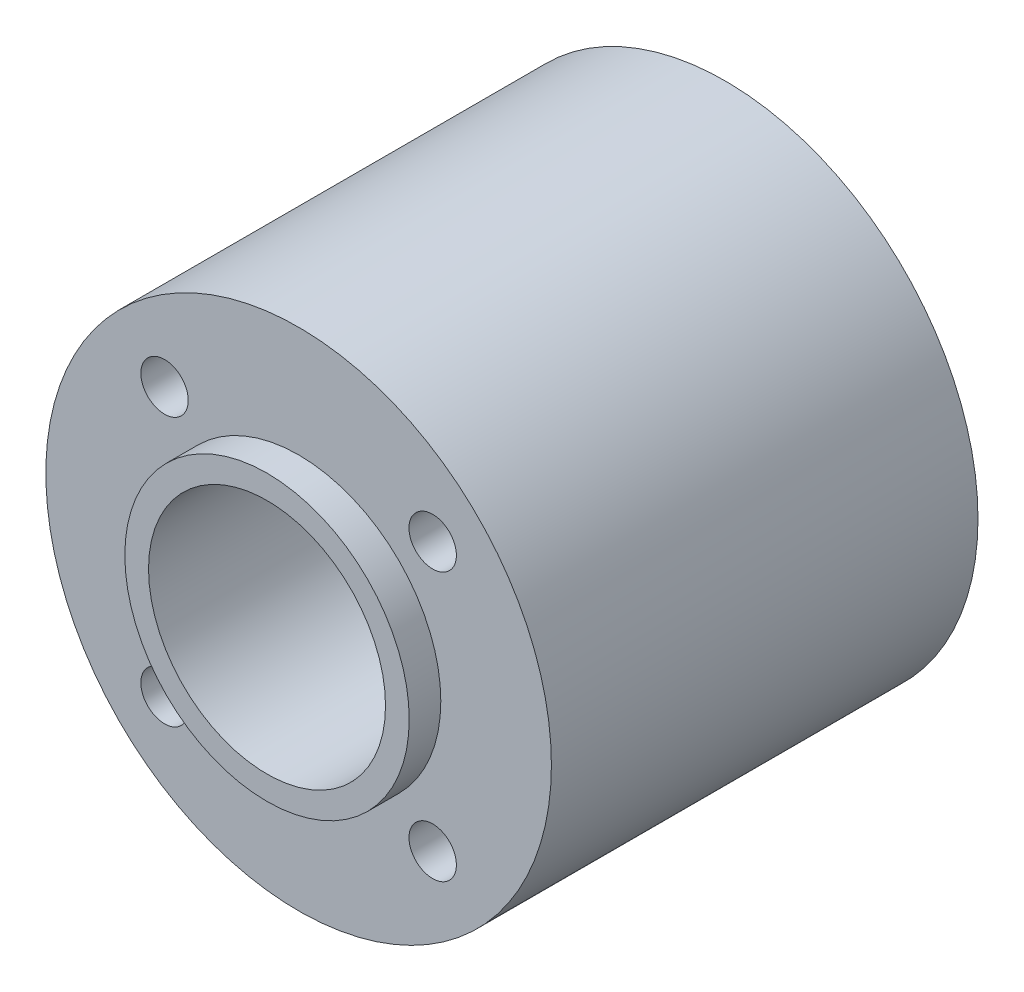
ISO-10303-21;
HEADER;
FILE_DESCRIPTION(('STEP AP214'),'2;1');
FILE_NAME('part.step','',(''),(''),'','','');
FILE_SCHEMA(('AUTOMOTIVE_DESIGN { 1 0 10303 214 1 1 1 1 }'));
ENDSEC;
DATA;
#1=APPLICATION_CONTEXT('core data for automotive mechanical design processes');
#2=APPLICATION_PROTOCOL_DEFINITION('international standard','automotive_design',2000,#1);
#3=PRODUCT_CONTEXT('',#1,'mechanical');
#4=PRODUCT('Part','Part','',(#3));
#5=PRODUCT_RELATED_PRODUCT_CATEGORY('part','',(#4));
#6=PRODUCT_DEFINITION_FORMATION('','',#4);
#7=PRODUCT_DEFINITION_CONTEXT('part definition',#1,'design');
#8=PRODUCT_DEFINITION('design','',#6,#7);
#9=PRODUCT_DEFINITION_SHAPE('','',#8);
#10=(LENGTH_UNIT() NAMED_UNIT(*) SI_UNIT(.MILLI.,.METRE.));
#11=(NAMED_UNIT(*) PLANE_ANGLE_UNIT() SI_UNIT($,.RADIAN.));
#12=(NAMED_UNIT(*) SI_UNIT($,.STERADIAN.) SOLID_ANGLE_UNIT());
#13=UNCERTAINTY_MEASURE_WITH_UNIT(LENGTH_MEASURE(1.E-05),#10,'distance_accuracy_value','');
#14=(GEOMETRIC_REPRESENTATION_CONTEXT(3) GLOBAL_UNCERTAINTY_ASSIGNED_CONTEXT((#13)) GLOBAL_UNIT_ASSIGNED_CONTEXT((#10,
#11,#12)) REPRESENTATION_CONTEXT('',''));
#15=CARTESIAN_POINT('',(0.,0.,0.));
#16=DIRECTION('',(0.,0.,1.));
#17=DIRECTION('',(1.,0.,0.));
#18=AXIS2_PLACEMENT_3D('',#15,#16,#17);
#19=CARTESIAN_POINT('',(0.,0.,0.));
#20=DIRECTION('',(0.,0.,1.));
#21=DIRECTION('',(1.,0.,0.));
#22=AXIS2_PLACEMENT_3D('',#19,#20,#21);
#23=PLANE('',#22);
#24=CARTESIAN_POINT('',(8.48528137423853,-8.48528137423862,0.));
#25=DIRECTION('',(0.,0.,1.));
#26=DIRECTION('',(-1.,0.,0.));
#27=AXIS2_PLACEMENT_3D('',#24,#25,#26);
#28=CIRCLE('',#27,1.5);
#29=CARTESIAN_POINT('',(6.98528137423853,-8.48528137423862,0.));
#30=VERTEX_POINT('',#29);
#31=EDGE_CURVE('E75',#30,#30,#28,.T.);
#32=ORIENTED_EDGE('',*,*,#31,.F.);
#33=EDGE_LOOP('',(#32));
#34=FACE_BOUND('',#33,.T.);
#35=CARTESIAN_POINT('',(8.48528137423853,8.48528137423862,0.));
#36=DIRECTION('',(0.,0.,-1.));
#37=DIRECTION('',(-1.,0.,0.));
#38=AXIS2_PLACEMENT_3D('',#35,#36,#37);
#39=CIRCLE('',#38,1.5);
#40=CARTESIAN_POINT('',(6.98528137423853,8.48528137423862,0.));
#41=VERTEX_POINT('',#40);
#42=EDGE_CURVE('E62',#41,#41,#39,.T.);
#43=ORIENTED_EDGE('',*,*,#42,.T.);
#44=EDGE_LOOP('',(#43));
#45=FACE_BOUND('',#44,.T.);
#46=CARTESIAN_POINT('',(-8.48528137423853,8.48528137423861,0.));
#47=DIRECTION('',(0.,0.,1.));
#48=DIRECTION('',(1.,0.,0.));
#49=AXIS2_PLACEMENT_3D('',#46,#47,#48);
#50=CIRCLE('',#49,1.5);
#51=CARTESIAN_POINT('',(-6.98528137423853,8.48528137423861,0.));
#52=VERTEX_POINT('',#51);
#53=EDGE_CURVE('E59',#52,#52,#50,.T.);
#54=ORIENTED_EDGE('',*,*,#53,.F.);
#55=EDGE_LOOP('',(#54));
#56=FACE_BOUND('',#55,.T.);
#57=CARTESIAN_POINT('',(0.,0.,0.));
#58=DIRECTION('',(0.,0.,1.));
#59=DIRECTION('',(1.,0.,0.));
#60=AXIS2_PLACEMENT_3D('',#57,#58,#59);
#61=CIRCLE('',#60,16.);
#62=CARTESIAN_POINT('',(16.,0.,0.));
#63=VERTEX_POINT('',#62);
#64=EDGE_CURVE('E45',#63,#63,#61,.T.);
#65=ORIENTED_EDGE('',*,*,#64,.T.);
#66=EDGE_LOOP('',(#65));
#67=FACE_BOUND('',#66,.T.);
#68=CARTESIAN_POINT('',(0.,0.,0.));
#69=DIRECTION('',(0.,0.,1.));
#70=DIRECTION('',(1.,0.,0.));
#71=AXIS2_PLACEMENT_3D('',#68,#69,#70);
#72=CIRCLE('',#71,9.);
#73=CARTESIAN_POINT('',(9.,0.,0.));
#74=VERTEX_POINT('',#73);
#75=EDGE_CURVE('E58',#74,#74,#72,.T.);
#76=ORIENTED_EDGE('',*,*,#75,.F.);
#77=EDGE_LOOP('',(#76));
#78=FACE_BOUND('',#77,.T.);
#79=CARTESIAN_POINT('',(-8.48528137423853,-8.48528137423861,0.));
#80=DIRECTION('',(0.,0.,-1.));
#81=DIRECTION('',(1.,0.,0.));
#82=AXIS2_PLACEMENT_3D('',#79,#80,#81);
#83=CIRCLE('',#82,1.5);
#84=CARTESIAN_POINT('',(-6.98528137423853,-8.48528137423861,0.));
#85=VERTEX_POINT('',#84);
#86=EDGE_CURVE('E65',#85,#85,#83,.T.);
#87=ORIENTED_EDGE('',*,*,#86,.T.);
#88=EDGE_LOOP('',(#87));
#89=FACE_BOUND('',#88,.T.);
#90=ADVANCED_FACE('F37',(#34,#45,#56,#67,#78,#89),#23,.T.);
#91=CARTESIAN_POINT('',(0.,0.,-27.));
#92=DIRECTION('',(0.,0.,1.));
#93=DIRECTION('',(1.,0.,0.));
#94=AXIS2_PLACEMENT_3D('',#91,#92,#93);
#95=PLANE('',#94);
#96=CARTESIAN_POINT('',(8.48528137423853,-8.48528137423862,-27.));
#97=DIRECTION('',(0.,0.,1.));
#98=DIRECTION('',(1.,0.,0.));
#99=AXIS2_PLACEMENT_3D('',#96,#97,#98);
#100=CIRCLE('',#99,1.5);
#101=CARTESIAN_POINT('',(9.98528137423853,-8.48528137423862,-27.));
#102=VERTEX_POINT('',#101);
#103=EDGE_CURVE('E41',#102,#102,#100,.T.);
#104=ORIENTED_EDGE('',*,*,#103,.T.);
#105=EDGE_LOOP('',(#104));
#106=FACE_BOUND('',#105,.T.);
#107=CARTESIAN_POINT('',(8.48528137423853,8.48528137423862,-27.));
#108=DIRECTION('',(0.,0.,1.));
#109=DIRECTION('',(1.,0.,0.));
#110=AXIS2_PLACEMENT_3D('',#107,#108,#109);
#111=CIRCLE('',#110,1.5);
#112=CARTESIAN_POINT('',(9.98528137423853,8.48528137423862,-27.));
#113=VERTEX_POINT('',#112);
#114=EDGE_CURVE('E60',#113,#113,#111,.F.);
#115=ORIENTED_EDGE('',*,*,#114,.F.);
#116=EDGE_LOOP('',(#115));
#117=FACE_BOUND('',#116,.T.);
#118=CARTESIAN_POINT('',(-8.48528137423853,8.48528137423861,-27.));
#119=DIRECTION('',(0.,0.,1.));
#120=DIRECTION('',(1.,0.,0.));
#121=AXIS2_PLACEMENT_3D('',#118,#119,#120);
#122=CIRCLE('',#121,1.5);
#123=CARTESIAN_POINT('',(-6.98528137423853,8.48528137423861,-27.));
#124=VERTEX_POINT('',#123);
#125=EDGE_CURVE('E55',#124,#124,#122,.T.);
#126=ORIENTED_EDGE('',*,*,#125,.T.);
#127=EDGE_LOOP('',(#126));
#128=FACE_BOUND('',#127,.T.);
#129=CARTESIAN_POINT('',(0.,0.,-27.));
#130=DIRECTION('',(0.,0.,1.));
#131=DIRECTION('',(1.,0.,0.));
#132=AXIS2_PLACEMENT_3D('',#129,#130,#131);
#133=CIRCLE('',#132,9.);
#134=CARTESIAN_POINT('',(9.,0.,-27.));
#135=VERTEX_POINT('',#134);
#136=EDGE_CURVE('E50',#135,#135,#133,.F.);
#137=ORIENTED_EDGE('',*,*,#136,.F.);
#138=EDGE_LOOP('',(#137));
#139=FACE_BOUND('',#138,.T.);
#140=CARTESIAN_POINT('',(0.,0.,-27.));
#141=DIRECTION('',(0.,0.,1.));
#142=DIRECTION('',(1.,0.,0.));
#143=AXIS2_PLACEMENT_3D('',#140,#141,#142);
#144=CIRCLE('',#143,16.);
#145=CARTESIAN_POINT('',(16.,0.,-27.));
#146=VERTEX_POINT('',#145);
#147=EDGE_CURVE('E10',#146,#146,#144,.T.);
#148=ORIENTED_EDGE('',*,*,#147,.F.);
#149=EDGE_LOOP('',(#148));
#150=FACE_BOUND('',#149,.T.);
#151=CARTESIAN_POINT('',(-8.48528137423853,-8.48528137423861,-27.));
#152=DIRECTION('',(0.,0.,1.));
#153=DIRECTION('',(1.,0.,0.));
#154=AXIS2_PLACEMENT_3D('',#151,#152,#153);
#155=CIRCLE('',#154,1.5);
#156=CARTESIAN_POINT('',(-6.98528137423853,-8.48528137423861,-27.));
#157=VERTEX_POINT('',#156);
#158=EDGE_CURVE('E63',#157,#157,#155,.F.);
#159=ORIENTED_EDGE('',*,*,#158,.F.);
#160=EDGE_LOOP('',(#159));
#161=FACE_BOUND('',#160,.T.);
#162=ADVANCED_FACE('F99',(#106,#117,#128,#139,#150,#161),#95,.F.);
#163=CARTESIAN_POINT('',(0.,0.,-27.));
#164=DIRECTION('',(0.,0.,1.));
#165=DIRECTION('',(1.,0.,0.));
#166=AXIS2_PLACEMENT_3D('',#163,#164,#165);
#167=CYLINDRICAL_SURFACE('',#166,16.);
#168=ORIENTED_EDGE('',*,*,#147,.T.);
#169=EDGE_LOOP('',(#168));
#170=FACE_BOUND('',#169,.T.);
#171=ORIENTED_EDGE('',*,*,#64,.F.);
#172=EDGE_LOOP('',(#171));
#173=FACE_BOUND('',#172,.T.);
#174=ADVANCED_FACE('F39',(#170,#173),#167,.T.);
#175=CARTESIAN_POINT('',(0.,0.,-30.));
#176=DIRECTION('',(0.,0.,1.));
#177=DIRECTION('',(1.,0.,0.));
#178=AXIS2_PLACEMENT_3D('',#175,#176,#177);
#179=CYLINDRICAL_SURFACE('',#178,9.);
#180=CARTESIAN_POINT('',(0.,0.,-30.));
#181=DIRECTION('',(0.,0.,-1.));
#182=DIRECTION('',(-1.,0.,0.));
#183=AXIS2_PLACEMENT_3D('',#180,#181,#182);
#184=CIRCLE('',#183,9.);
#185=CARTESIAN_POINT('',(-9.,0.,-30.));
#186=VERTEX_POINT('',#185);
#187=EDGE_CURVE('E90',#186,#186,#184,.T.);
#188=ORIENTED_EDGE('',*,*,#187,.F.);
#189=EDGE_LOOP('',(#188));
#190=FACE_BOUND('',#189,.T.);
#191=ORIENTED_EDGE('',*,*,#136,.T.);
#192=EDGE_LOOP('',(#191));
#193=FACE_BOUND('',#192,.T.);
#194=ADVANCED_FACE('F97',(#190,#193),#179,.T.);
#195=CARTESIAN_POINT('',(0.,0.,-30.));
#196=DIRECTION('',(0.,0.,-1.));
#197=DIRECTION('',(-1.,0.,0.));
#198=AXIS2_PLACEMENT_3D('',#195,#196,#197);
#199=PLANE('',#198);
#200=ORIENTED_EDGE('',*,*,#187,.T.);
#201=EDGE_LOOP('',(#200));
#202=FACE_BOUND('',#201,.T.);
#203=CARTESIAN_POINT('',(0.,0.,-30.));
#204=DIRECTION('',(0.,0.,-1.));
#205=DIRECTION('',(-1.,0.,0.));
#206=AXIS2_PLACEMENT_3D('',#203,#204,#205);
#207=CIRCLE('',#206,7.5);
#208=CARTESIAN_POINT('',(-7.5,0.,-30.));
#209=VERTEX_POINT('',#208);
#210=EDGE_CURVE('E86',#209,#209,#207,.T.);
#211=ORIENTED_EDGE('',*,*,#210,.F.);
#212=EDGE_LOOP('',(#211));
#213=FACE_BOUND('',#212,.T.);
#214=ADVANCED_FACE('F114',(#202,#213),#199,.T.);
#215=CARTESIAN_POINT('',(0.,0.,-30.));
#216=DIRECTION('',(0.,0.,1.));
#217=DIRECTION('',(1.,0.,0.));
#218=AXIS2_PLACEMENT_3D('',#215,#216,#217);
#219=CYLINDRICAL_SURFACE('',#218,7.5);
#220=ORIENTED_EDGE('',*,*,#210,.T.);
#221=EDGE_LOOP('',(#220));
#222=FACE_BOUND('',#221,.T.);
#223=CARTESIAN_POINT('',(0.,0.,2.));
#224=DIRECTION('',(0.,0.,1.));
#225=DIRECTION('',(1.,0.,0.));
#226=AXIS2_PLACEMENT_3D('',#223,#224,#225);
#227=CIRCLE('',#226,7.5);
#228=CARTESIAN_POINT('',(7.5,0.,2.));
#229=VERTEX_POINT('',#228);
#230=EDGE_CURVE('E80',#229,#229,#227,.T.);
#231=ORIENTED_EDGE('',*,*,#230,.T.);
#232=EDGE_LOOP('',(#231));
#233=FACE_BOUND('',#232,.T.);
#234=ADVANCED_FACE('F118',(#222,#233),#219,.F.);
#235=CARTESIAN_POINT('',(0.,0.,2.));
#236=DIRECTION('',(0.,0.,-1.));
#237=DIRECTION('',(-1.,0.,0.));
#238=AXIS2_PLACEMENT_3D('',#235,#236,#237);
#239=CYLINDRICAL_SURFACE('',#238,9.);
#240=CARTESIAN_POINT('',(0.,0.,2.));
#241=DIRECTION('',(0.,0.,1.));
#242=DIRECTION('',(1.,0.,0.));
#243=AXIS2_PLACEMENT_3D('',#240,#241,#242);
#244=CIRCLE('',#243,9.);
#245=CARTESIAN_POINT('',(9.,0.,2.));
#246=VERTEX_POINT('',#245);
#247=EDGE_CURVE('E83',#246,#246,#244,.T.);
#248=ORIENTED_EDGE('',*,*,#247,.F.);
#249=EDGE_LOOP('',(#248));
#250=FACE_BOUND('',#249,.T.);
#251=ORIENTED_EDGE('',*,*,#75,.T.);
#252=EDGE_LOOP('',(#251));
#253=FACE_BOUND('',#252,.T.);
#254=ADVANCED_FACE('F121',(#250,#253),#239,.T.);
#255=CARTESIAN_POINT('',(0.,0.,2.));
#256=DIRECTION('',(0.,0.,1.));
#257=DIRECTION('',(1.,0.,0.));
#258=AXIS2_PLACEMENT_3D('',#255,#256,#257);
#259=PLANE('',#258);
#260=ORIENTED_EDGE('',*,*,#230,.F.);
#261=EDGE_LOOP('',(#260));
#262=FACE_BOUND('',#261,.T.);
#263=ORIENTED_EDGE('',*,*,#247,.T.);
#264=EDGE_LOOP('',(#263));
#265=FACE_BOUND('',#264,.T.);
#266=ADVANCED_FACE('F125',(#262,#265),#259,.T.);
#267=CARTESIAN_POINT('',(-8.48528137423853,8.48528137423861,-30.));
#268=DIRECTION('',(0.,0.,1.));
#269=DIRECTION('',(1.,0.,0.));
#270=AXIS2_PLACEMENT_3D('',#267,#268,#269);
#271=CYLINDRICAL_SURFACE('',#270,1.5);
#272=ORIENTED_EDGE('',*,*,#53,.T.);
#273=EDGE_LOOP('',(#272));
#274=FACE_BOUND('',#273,.T.);
#275=ORIENTED_EDGE('',*,*,#125,.F.);
#276=EDGE_LOOP('',(#275));
#277=FACE_BOUND('',#276,.T.);
#278=ADVANCED_FACE('F129',(#274,#277),#271,.F.);
#279=CARTESIAN_POINT('',(8.48528137423853,8.48528137423862,-30.));
#280=DIRECTION('',(0.,0.,1.));
#281=DIRECTION('',(1.,0.,0.));
#282=AXIS2_PLACEMENT_3D('',#279,#280,#281);
#283=CYLINDRICAL_SURFACE('',#282,1.5);
#284=ORIENTED_EDGE('',*,*,#42,.F.);
#285=EDGE_LOOP('',(#284));
#286=FACE_BOUND('',#285,.T.);
#287=ORIENTED_EDGE('',*,*,#114,.T.);
#288=EDGE_LOOP('',(#287));
#289=FACE_BOUND('',#288,.T.);
#290=ADVANCED_FACE('F133',(#286,#289),#283,.F.);
#291=CARTESIAN_POINT('',(-8.48528137423853,-8.48528137423861,-30.));
#292=DIRECTION('',(0.,0.,1.));
#293=DIRECTION('',(1.,0.,0.));
#294=AXIS2_PLACEMENT_3D('',#291,#292,#293);
#295=CYLINDRICAL_SURFACE('',#294,1.5);
#296=ORIENTED_EDGE('',*,*,#86,.F.);
#297=EDGE_LOOP('',(#296));
#298=FACE_BOUND('',#297,.T.);
#299=ORIENTED_EDGE('',*,*,#158,.T.);
#300=EDGE_LOOP('',(#299));
#301=FACE_BOUND('',#300,.T.);
#302=ADVANCED_FACE('F137',(#298,#301),#295,.F.);
#303=CARTESIAN_POINT('',(8.48528137423853,-8.48528137423862,-30.));
#304=DIRECTION('',(0.,0.,1.));
#305=DIRECTION('',(1.,0.,0.));
#306=AXIS2_PLACEMENT_3D('',#303,#304,#305);
#307=CYLINDRICAL_SURFACE('',#306,1.5);
#308=ORIENTED_EDGE('',*,*,#31,.T.);
#309=EDGE_LOOP('',(#308));
#310=FACE_BOUND('',#309,.T.);
#311=ORIENTED_EDGE('',*,*,#103,.F.);
#312=EDGE_LOOP('',(#311));
#313=FACE_BOUND('',#312,.T.);
#314=ADVANCED_FACE('F141',(#310,#313),#307,.F.);
#315=CLOSED_SHELL('',(#90,#162,#174,#194,#214,#234,#254,#266,#278,#290,#302,#314));
#316=MANIFOLD_SOLID_BREP('B2',#315);
#317=ADVANCED_BREP_SHAPE_REPRESENTATION('',(#18,#316),#14);
#318=SHAPE_DEFINITION_REPRESENTATION(#9,#317);
ENDSEC;
END-ISO-10303-21;
